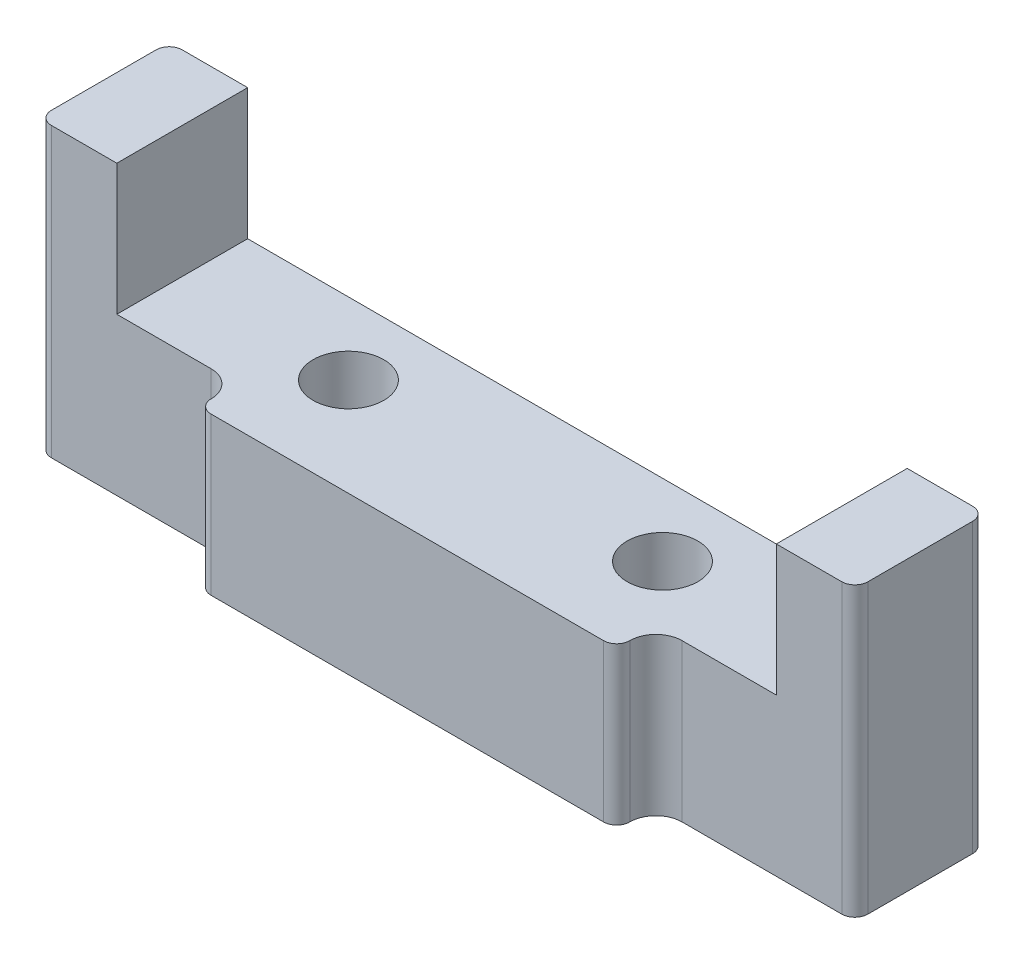
ISO-10303-21;
HEADER;
FILE_DESCRIPTION(('STEP AP214'),'2;1');
FILE_NAME('part.step','',(''),(''),'','','');
FILE_SCHEMA(('AUTOMOTIVE_DESIGN { 1 0 10303 214 1 1 1 1 }'));
ENDSEC;
DATA;
#1=APPLICATION_CONTEXT('core data for automotive mechanical design processes');
#2=APPLICATION_PROTOCOL_DEFINITION('international standard','automotive_design',2000,#1);
#3=PRODUCT_CONTEXT('',#1,'mechanical');
#4=PRODUCT('Part','Part','',(#3));
#5=PRODUCT_RELATED_PRODUCT_CATEGORY('part','',(#4));
#6=PRODUCT_DEFINITION_FORMATION('','',#4);
#7=PRODUCT_DEFINITION_CONTEXT('part definition',#1,'design');
#8=PRODUCT_DEFINITION('design','',#6,#7);
#9=PRODUCT_DEFINITION_SHAPE('','',#8);
#10=(LENGTH_UNIT() NAMED_UNIT(*) SI_UNIT(.MILLI.,.METRE.));
#11=(NAMED_UNIT(*) PLANE_ANGLE_UNIT() SI_UNIT($,.RADIAN.));
#12=(NAMED_UNIT(*) SI_UNIT($,.STERADIAN.) SOLID_ANGLE_UNIT());
#13=UNCERTAINTY_MEASURE_WITH_UNIT(LENGTH_MEASURE(1.E-05),#10,'distance_accuracy_value','');
#14=(GEOMETRIC_REPRESENTATION_CONTEXT(3) GLOBAL_UNCERTAINTY_ASSIGNED_CONTEXT((#13)) GLOBAL_UNIT_ASSIGNED_CONTEXT((#10,
#11,#12)) REPRESENTATION_CONTEXT('',''));
#15=CARTESIAN_POINT('',(0.,0.,0.));
#16=DIRECTION('',(0.,0.,1.));
#17=DIRECTION('',(1.,0.,0.));
#18=AXIS2_PLACEMENT_3D('',#15,#16,#17);
#19=CARTESIAN_POINT('',(0.,0.,5.));
#20=DIRECTION('',(0.,0.,1.));
#21=DIRECTION('',(1.,0.,0.));
#22=AXIS2_PLACEMENT_3D('',#19,#20,#21);
#23=PLANE('',#22);
#24=DIRECTION('',(-1.,0.,0.));
#25=VECTOR('',#24,1.);
#26=CARTESIAN_POINT('',(0.,2.5,5.));
#27=LINE('',#26,#25);
#28=CARTESIAN_POINT('',(-12.6,2.5,5.));
#29=VERTEX_POINT('',#28);
#30=CARTESIAN_POINT('',(-15.1,2.5,5.));
#31=VERTEX_POINT('',#30);
#32=EDGE_CURVE('E196',#29,#31,#27,.T.);
#33=ORIENTED_EDGE('',*,*,#32,.T.);
#34=DIRECTION('',(0.,-1.,0.));
#35=VECTOR('',#34,1.);
#36=CARTESIAN_POINT('',(-15.1,-8.5,5.));
#37=LINE('',#36,#35);
#38=CARTESIAN_POINT('',(-15.1,-8.5,5.));
#39=VERTEX_POINT('',#38);
#40=EDGE_CURVE('E285',#31,#39,#37,.T.);
#41=ORIENTED_EDGE('',*,*,#40,.T.);
#42=DIRECTION('',(1.,0.,0.));
#43=VECTOR('',#42,1.);
#44=CARTESIAN_POINT('',(0.,-8.5,5.));
#45=LINE('',#44,#43);
#46=CARTESIAN_POINT('',(-9.,-8.5,5.));
#47=VERTEX_POINT('',#46);
#48=EDGE_CURVE('E200',#39,#47,#45,.T.);
#49=ORIENTED_EDGE('',*,*,#48,.T.);
#50=DIRECTION('',(0.,-1.,0.));
#51=VECTOR('',#50,1.);
#52=CARTESIAN_POINT('',(-9.,0.,5.));
#53=LINE('',#52,#51);
#54=CARTESIAN_POINT('',(-9.,-2.5,5.));
#55=VERTEX_POINT('',#54);
#56=EDGE_CURVE('E238',#47,#55,#53,.F.);
#57=ORIENTED_EDGE('',*,*,#56,.T.);
#58=DIRECTION('',(-1.,0.,0.));
#59=VECTOR('',#58,1.);
#60=CARTESIAN_POINT('',(0.,-2.5,5.));
#61=LINE('',#60,#59);
#62=CARTESIAN_POINT('',(-12.6,-2.5,5.));
#63=VERTEX_POINT('',#62);
#64=EDGE_CURVE('E188',#55,#63,#61,.T.);
#65=ORIENTED_EDGE('',*,*,#64,.T.);
#66=DIRECTION('',(0.,1.,0.));
#67=VECTOR('',#66,1.);
#68=CARTESIAN_POINT('',(-12.6,0.,5.));
#69=LINE('',#68,#67);
#70=EDGE_CURVE('E194',#63,#29,#69,.T.);
#71=ORIENTED_EDGE('',*,*,#70,.T.);
#72=EDGE_LOOP('',(#33,#41,#49,#57,#65,#71));
#73=FACE_BOUND('',#72,.T.);
#74=ADVANCED_FACE('F36',(#73),#23,.T.);
#75=CARTESIAN_POINT('',(15.6,0.,5.));
#76=DIRECTION('',(-1.,0.,0.));
#77=DIRECTION('',(0.,-1.,0.));
#78=AXIS2_PLACEMENT_3D('',#75,#76,#77);
#79=PLANE('',#78);
#80=DIRECTION('',(0.,0.,-1.));
#81=VECTOR('',#80,1.);
#82=CARTESIAN_POINT('',(15.6,-8.5,5.));
#83=LINE('',#82,#81);
#84=CARTESIAN_POINT('',(15.6,-8.5,4.5));
#85=VERTEX_POINT('',#84);
#86=CARTESIAN_POINT('',(15.6,-8.5,0.5));
#87=VERTEX_POINT('',#86);
#88=EDGE_CURVE('E202',#85,#87,#83,.T.);
#89=ORIENTED_EDGE('',*,*,#88,.T.);
#90=DIRECTION('',(0.,1.,0.));
#91=VECTOR('',#90,1.);
#92=CARTESIAN_POINT('',(15.6,0.,0.5));
#93=LINE('',#92,#91);
#94=CARTESIAN_POINT('',(15.6,2.5,0.5));
#95=VERTEX_POINT('',#94);
#96=EDGE_CURVE('E251',#87,#95,#93,.T.);
#97=ORIENTED_EDGE('',*,*,#96,.T.);
#98=DIRECTION('',(0.,0.,-1.));
#99=VECTOR('',#98,1.);
#100=CARTESIAN_POINT('',(15.6,2.5,5.));
#101=LINE('',#100,#99);
#102=CARTESIAN_POINT('',(15.6,2.5,4.5));
#103=VERTEX_POINT('',#102);
#104=EDGE_CURVE('E183',#103,#95,#101,.T.);
#105=ORIENTED_EDGE('',*,*,#104,.F.);
#106=DIRECTION('',(0.,1.,0.));
#107=VECTOR('',#106,1.);
#108=CARTESIAN_POINT('',(15.6,-8.5,4.5));
#109=LINE('',#108,#107);
#110=EDGE_CURVE('E249',#103,#85,#109,.F.);
#111=ORIENTED_EDGE('',*,*,#110,.T.);
#112=EDGE_LOOP('',(#89,#97,#105,#111));
#113=FACE_BOUND('',#112,.T.);
#114=ADVANCED_FACE('F320',(#113),#79,.F.);
#115=CARTESIAN_POINT('',(0.,2.5,5.));
#116=DIRECTION('',(0.,-1.,0.));
#117=DIRECTION('',(1.,0.,0.));
#118=AXIS2_PLACEMENT_3D('',#115,#116,#117);
#119=PLANE('',#118);
#120=ORIENTED_EDGE('',*,*,#104,.T.);
#121=CARTESIAN_POINT('',(15.1,2.5,0.5));
#122=DIRECTION('',(0.,-1.,0.));
#123=DIRECTION('',(1.,0.,0.));
#124=AXIS2_PLACEMENT_3D('',#121,#122,#123);
#125=CIRCLE('',#124,0.5);
#126=CARTESIAN_POINT('',(15.1,2.5,0.));
#127=VERTEX_POINT('',#126);
#128=EDGE_CURVE('E256',#95,#127,#125,.F.);
#129=ORIENTED_EDGE('',*,*,#128,.T.);
#130=DIRECTION('',(-1.,0.,0.));
#131=VECTOR('',#130,1.);
#132=CARTESIAN_POINT('',(0.,2.5,0.));
#133=LINE('',#132,#131);
#134=CARTESIAN_POINT('',(12.6,2.5,0.));
#135=VERTEX_POINT('',#134);
#136=EDGE_CURVE('E179',#127,#135,#133,.T.);
#137=ORIENTED_EDGE('',*,*,#136,.T.);
#138=DIRECTION('',(0.,0.,-1.));
#139=VECTOR('',#138,1.);
#140=CARTESIAN_POINT('',(12.6,2.5,5.));
#141=LINE('',#140,#139);
#142=CARTESIAN_POINT('',(12.6,2.5,5.));
#143=VERTEX_POINT('',#142);
#144=EDGE_CURVE('E175',#143,#135,#141,.T.);
#145=ORIENTED_EDGE('',*,*,#144,.F.);
#146=DIRECTION('',(-1.,0.,0.));
#147=VECTOR('',#146,1.);
#148=CARTESIAN_POINT('',(0.,2.5,5.));
#149=LINE('',#148,#147);
#150=CARTESIAN_POINT('',(15.1,2.5,5.));
#151=VERTEX_POINT('',#150);
#152=EDGE_CURVE('E162',#151,#143,#149,.T.);
#153=ORIENTED_EDGE('',*,*,#152,.F.);
#154=CARTESIAN_POINT('',(15.1,2.5,4.5));
#155=DIRECTION('',(0.,-1.,0.));
#156=DIRECTION('',(1.,0.,0.));
#157=AXIS2_PLACEMENT_3D('',#154,#155,#156);
#158=CIRCLE('',#157,0.5);
#159=EDGE_CURVE('E254',#151,#103,#158,.F.);
#160=ORIENTED_EDGE('',*,*,#159,.T.);
#161=EDGE_LOOP('',(#120,#129,#137,#145,#153,#160));
#162=FACE_BOUND('',#161,.T.);
#163=ADVANCED_FACE('F177',(#162),#119,.F.);
#164=CARTESIAN_POINT('',(12.6,0.,5.));
#165=DIRECTION('',(-1.,0.,0.));
#166=DIRECTION('',(0.,0.,1.));
#167=AXIS2_PLACEMENT_3D('',#164,#165,#166);
#168=PLANE('',#167);
#169=DIRECTION('',(0.,1.,0.));
#170=VECTOR('',#169,1.);
#171=CARTESIAN_POINT('',(12.6,0.,0.));
#172=LINE('',#171,#170);
#173=CARTESIAN_POINT('',(12.6,-2.5,0.));
#174=VERTEX_POINT('',#173);
#175=EDGE_CURVE('E204',#174,#135,#172,.T.);
#176=ORIENTED_EDGE('',*,*,#175,.F.);
#177=DIRECTION('',(0.,0.,-1.));
#178=VECTOR('',#177,1.);
#179=CARTESIAN_POINT('',(12.6,-2.5,5.));
#180=LINE('',#179,#178);
#181=CARTESIAN_POINT('',(12.6,-2.5,5.));
#182=VERTEX_POINT('',#181);
#183=EDGE_CURVE('E184',#182,#174,#180,.T.);
#184=ORIENTED_EDGE('',*,*,#183,.F.);
#185=DIRECTION('',(0.,1.,0.));
#186=VECTOR('',#185,1.);
#187=CARTESIAN_POINT('',(12.6,0.,5.));
#188=LINE('',#187,#186);
#189=EDGE_CURVE('E168',#182,#143,#188,.T.);
#190=ORIENTED_EDGE('',*,*,#189,.T.);
#191=ORIENTED_EDGE('',*,*,#144,.T.);
#192=EDGE_LOOP('',(#176,#184,#190,#191));
#193=FACE_BOUND('',#192,.T.);
#194=ADVANCED_FACE('F186',(#193),#168,.T.);
#195=CARTESIAN_POINT('',(0.,-2.5,5.));
#196=DIRECTION('',(0.,-1.,0.));
#197=DIRECTION('',(1.,0.,0.));
#198=AXIS2_PLACEMENT_3D('',#195,#196,#197);
#199=PLANE('',#198);
#200=CARTESIAN_POINT('',(-6.,-2.5,2.75));
#201=DIRECTION('',(0.,-1.,0.));
#202=DIRECTION('',(1.,0.,0.));
#203=AXIS2_PLACEMENT_3D('',#200,#201,#202);
#204=CIRCLE('',#203,1.35);
#205=CARTESIAN_POINT('',(-4.65,-2.5,2.75));
#206=VERTEX_POINT('',#205);
#207=EDGE_CURVE('E395',#206,#206,#204,.T.);
#208=ORIENTED_EDGE('',*,*,#207,.T.);
#209=EDGE_LOOP('',(#208));
#210=FACE_BOUND('',#209,.T.);
#211=CARTESIAN_POINT('',(6.,-2.5,2.75));
#212=DIRECTION('',(0.,-1.,0.));
#213=DIRECTION('',(1.,0.,0.));
#214=AXIS2_PLACEMENT_3D('',#211,#212,#213);
#215=CIRCLE('',#214,1.35);
#216=CARTESIAN_POINT('',(7.35,-2.5,2.75));
#217=VERTEX_POINT('',#216);
#218=EDGE_CURVE('E400',#217,#217,#215,.T.);
#219=ORIENTED_EDGE('',*,*,#218,.T.);
#220=EDGE_LOOP('',(#219));
#221=FACE_BOUND('',#220,.T.);
#222=DIRECTION('',(-1.,0.,0.));
#223=VECTOR('',#222,1.);
#224=CARTESIAN_POINT('',(8.,-2.5,6.5));
#225=LINE('',#224,#223);
#226=CARTESIAN_POINT('',(7.5,-2.5,6.5));
#227=VERTEX_POINT('',#226);
#228=CARTESIAN_POINT('',(-7.5,-2.5,6.5));
#229=VERTEX_POINT('',#228);
#230=EDGE_CURVE('E205',#227,#229,#225,.T.);
#231=ORIENTED_EDGE('',*,*,#230,.F.);
#232=CARTESIAN_POINT('',(7.5,-2.5,6.));
#233=DIRECTION('',(0.,-1.,0.));
#234=DIRECTION('',(1.,0.,0.));
#235=AXIS2_PLACEMENT_3D('',#232,#233,#234);
#236=CIRCLE('',#235,0.5);
#237=CARTESIAN_POINT('',(8.,-2.5,6.));
#238=VERTEX_POINT('',#237);
#239=EDGE_CURVE('E283',#227,#238,#236,.F.);
#240=ORIENTED_EDGE('',*,*,#239,.T.);
#241=CARTESIAN_POINT('',(9.,-2.5,6.));
#242=DIRECTION('',(0.,-1.,0.));
#243=DIRECTION('',(1.,0.,0.));
#244=AXIS2_PLACEMENT_3D('',#241,#242,#243);
#245=CIRCLE('',#244,1.);
#246=CARTESIAN_POINT('',(9.,-2.5,5.));
#247=VERTEX_POINT('',#246);
#248=EDGE_CURVE('E240',#238,#247,#245,.T.);
#249=ORIENTED_EDGE('',*,*,#248,.T.);
#250=EDGE_CURVE('E190',#182,#247,#61,.T.);
#251=ORIENTED_EDGE('',*,*,#250,.F.);
#252=ORIENTED_EDGE('',*,*,#183,.T.);
#253=DIRECTION('',(-1.,0.,0.));
#254=VECTOR('',#253,1.);
#255=CARTESIAN_POINT('',(0.,-2.5,0.));
#256=LINE('',#255,#254);
#257=CARTESIAN_POINT('',(-12.6,-2.5,0.));
#258=VERTEX_POINT('',#257);
#259=EDGE_CURVE('E207',#174,#258,#256,.T.);
#260=ORIENTED_EDGE('',*,*,#259,.T.);
#261=DIRECTION('',(0.,0.,-1.));
#262=VECTOR('',#261,1.);
#263=CARTESIAN_POINT('',(-12.6,-2.5,5.));
#264=LINE('',#263,#262);
#265=EDGE_CURVE('E225',#63,#258,#264,.T.);
#266=ORIENTED_EDGE('',*,*,#265,.F.);
#267=ORIENTED_EDGE('',*,*,#64,.F.);
#268=CARTESIAN_POINT('',(-9.,-2.5,6.));
#269=DIRECTION('',(0.,-1.,0.));
#270=DIRECTION('',(1.,0.,0.));
#271=AXIS2_PLACEMENT_3D('',#268,#269,#270);
#272=CIRCLE('',#271,1.);
#273=CARTESIAN_POINT('',(-8.,-2.5,6.));
#274=VERTEX_POINT('',#273);
#275=EDGE_CURVE('E247',#55,#274,#272,.T.);
#276=ORIENTED_EDGE('',*,*,#275,.T.);
#277=CARTESIAN_POINT('',(-7.5,-2.5,6.));
#278=DIRECTION('',(0.,-1.,0.));
#279=DIRECTION('',(1.,0.,0.));
#280=AXIS2_PLACEMENT_3D('',#277,#278,#279);
#281=CIRCLE('',#280,0.5);
#282=EDGE_CURVE('E281',#274,#229,#281,.F.);
#283=ORIENTED_EDGE('',*,*,#282,.T.);
#284=EDGE_LOOP('',(#231,#240,#249,#251,#252,#260,#266,#267,#276,#283));
#285=FACE_BOUND('',#284,.T.);
#286=ADVANCED_FACE('F349',(#210,#221,#285),#199,.F.);
#287=CARTESIAN_POINT('',(-12.6,0.,5.));
#288=DIRECTION('',(-1.,0.,0.));
#289=DIRECTION('',(0.,0.,1.));
#290=AXIS2_PLACEMENT_3D('',#287,#288,#289);
#291=PLANE('',#290);
#292=DIRECTION('',(0.,1.,0.));
#293=VECTOR('',#292,1.);
#294=CARTESIAN_POINT('',(-12.6,0.,0.));
#295=LINE('',#294,#293);
#296=CARTESIAN_POINT('',(-12.6,2.5,0.));
#297=VERTEX_POINT('',#296);
#298=EDGE_CURVE('E209',#258,#297,#295,.T.);
#299=ORIENTED_EDGE('',*,*,#298,.T.);
#300=DIRECTION('',(0.,0.,-1.));
#301=VECTOR('',#300,1.);
#302=CARTESIAN_POINT('',(-12.6,2.5,5.));
#303=LINE('',#302,#301);
#304=EDGE_CURVE('E222',#29,#297,#303,.T.);
#305=ORIENTED_EDGE('',*,*,#304,.F.);
#306=ORIENTED_EDGE('',*,*,#70,.F.);
#307=ORIENTED_EDGE('',*,*,#265,.T.);
#308=EDGE_LOOP('',(#299,#305,#306,#307));
#309=FACE_BOUND('',#308,.T.);
#310=ADVANCED_FACE('F346',(#309),#291,.F.);
#311=CARTESIAN_POINT('',(0.,2.5,5.));
#312=DIRECTION('',(0.,-1.,0.));
#313=DIRECTION('',(1.,0.,0.));
#314=AXIS2_PLACEMENT_3D('',#311,#312,#313);
#315=PLANE('',#314);
#316=DIRECTION('',(0.,0.,-1.));
#317=VECTOR('',#316,1.);
#318=CARTESIAN_POINT('',(-15.6,2.5,5.));
#319=LINE('',#318,#317);
#320=CARTESIAN_POINT('',(-15.6,2.5,4.5));
#321=VERTEX_POINT('',#320);
#322=CARTESIAN_POINT('',(-15.6,2.5,0.5));
#323=VERTEX_POINT('',#322);
#324=EDGE_CURVE('E220',#321,#323,#319,.T.);
#325=ORIENTED_EDGE('',*,*,#324,.F.);
#326=CARTESIAN_POINT('',(-15.1,2.5,4.5));
#327=DIRECTION('',(0.,-1.,0.));
#328=DIRECTION('',(1.,0.,0.));
#329=AXIS2_PLACEMENT_3D('',#326,#327,#328);
#330=CIRCLE('',#329,0.5);
#331=EDGE_CURVE('E11',#321,#31,#330,.F.);
#332=ORIENTED_EDGE('',*,*,#331,.T.);
#333=ORIENTED_EDGE('',*,*,#32,.F.);
#334=ORIENTED_EDGE('',*,*,#304,.T.);
#335=DIRECTION('',(-1.,0.,0.));
#336=VECTOR('',#335,1.);
#337=CARTESIAN_POINT('',(0.,2.5,0.));
#338=LINE('',#337,#336);
#339=CARTESIAN_POINT('',(-15.1,2.5,0.));
#340=VERTEX_POINT('',#339);
#341=EDGE_CURVE('E211',#297,#340,#338,.T.);
#342=ORIENTED_EDGE('',*,*,#341,.T.);
#343=CARTESIAN_POINT('',(-15.1,2.5,0.5));
#344=DIRECTION('',(0.,-1.,0.));
#345=DIRECTION('',(1.,0.,0.));
#346=AXIS2_PLACEMENT_3D('',#343,#344,#345);
#347=CIRCLE('',#346,0.5);
#348=EDGE_CURVE('E44',#340,#323,#347,.F.);
#349=ORIENTED_EDGE('',*,*,#348,.T.);
#350=EDGE_LOOP('',(#325,#332,#333,#334,#342,#349));
#351=FACE_BOUND('',#350,.T.);
#352=ADVANCED_FACE('F306',(#351),#315,.F.);
#353=CARTESIAN_POINT('',(-15.6,0.,5.));
#354=DIRECTION('',(1.,0.,0.));
#355=DIRECTION('',(0.,1.,0.));
#356=AXIS2_PLACEMENT_3D('',#353,#354,#355);
#357=PLANE('',#356);
#358=DIRECTION('',(0.,0.,-1.));
#359=VECTOR('',#358,1.);
#360=CARTESIAN_POINT('',(-15.6,-8.5,5.));
#361=LINE('',#360,#359);
#362=CARTESIAN_POINT('',(-15.6,-8.5,4.5));
#363=VERTEX_POINT('',#362);
#364=CARTESIAN_POINT('',(-15.6,-8.5,0.5));
#365=VERTEX_POINT('',#364);
#366=EDGE_CURVE('E217',#363,#365,#361,.T.);
#367=ORIENTED_EDGE('',*,*,#366,.F.);
#368=DIRECTION('',(0.,-1.,0.));
#369=VECTOR('',#368,1.);
#370=CARTESIAN_POINT('',(-15.6,2.5,4.5));
#371=LINE('',#370,#369);
#372=EDGE_CURVE('E57',#363,#321,#371,.F.);
#373=ORIENTED_EDGE('',*,*,#372,.T.);
#374=ORIENTED_EDGE('',*,*,#324,.T.);
#375=DIRECTION('',(0.,-1.,0.));
#376=VECTOR('',#375,1.);
#377=CARTESIAN_POINT('',(-15.6,0.,0.5));
#378=LINE('',#377,#376);
#379=EDGE_CURVE('E288',#323,#365,#378,.T.);
#380=ORIENTED_EDGE('',*,*,#379,.T.);
#381=EDGE_LOOP('',(#367,#373,#374,#380));
#382=FACE_BOUND('',#381,.T.);
#383=ADVANCED_FACE('F292',(#382),#357,.F.);
#384=CARTESIAN_POINT('',(0.,-8.5,5.));
#385=DIRECTION('',(0.,1.,0.));
#386=DIRECTION('',(0.,0.,1.));
#387=AXIS2_PLACEMENT_3D('',#384,#385,#386);
#388=PLANE('',#387);
#389=CARTESIAN_POINT('',(-6.,-8.5,2.75));
#390=DIRECTION('',(0.,-1.,0.));
#391=DIRECTION('',(0.,0.,-1.));
#392=AXIS2_PLACEMENT_3D('',#389,#390,#391);
#393=CIRCLE('',#392,1.35);
#394=CARTESIAN_POINT('',(-6.,-8.5,1.4));
#395=VERTEX_POINT('',#394);
#396=EDGE_CURVE('E403',#395,#395,#393,.T.);
#397=ORIENTED_EDGE('',*,*,#396,.F.);
#398=EDGE_LOOP('',(#397));
#399=FACE_BOUND('',#398,.T.);
#400=CARTESIAN_POINT('',(6.,-8.5,2.75));
#401=DIRECTION('',(0.,-1.,0.));
#402=DIRECTION('',(0.,0.,1.));
#403=AXIS2_PLACEMENT_3D('',#400,#401,#402);
#404=CIRCLE('',#403,1.35);
#405=CARTESIAN_POINT('',(6.,-8.5,4.1));
#406=VERTEX_POINT('',#405);
#407=EDGE_CURVE('E404',#406,#406,#404,.T.);
#408=ORIENTED_EDGE('',*,*,#407,.F.);
#409=EDGE_LOOP('',(#408));
#410=FACE_BOUND('',#409,.T.);
#411=DIRECTION('',(1.,0.,0.));
#412=VECTOR('',#411,1.);
#413=CARTESIAN_POINT('',(0.,-8.5,0.));
#414=LINE('',#413,#412);
#415=CARTESIAN_POINT('',(-15.1,-8.5,0.));
#416=VERTEX_POINT('',#415);
#417=CARTESIAN_POINT('',(15.1,-8.5,0.));
#418=VERTEX_POINT('',#417);
#419=EDGE_CURVE('E172',#416,#418,#414,.T.);
#420=ORIENTED_EDGE('',*,*,#419,.T.);
#421=CARTESIAN_POINT('',(15.1,-8.5,0.5));
#422=DIRECTION('',(0.,1.,0.));
#423=DIRECTION('',(0.,0.,1.));
#424=AXIS2_PLACEMENT_3D('',#421,#422,#423);
#425=CIRCLE('',#424,0.5);
#426=EDGE_CURVE('E272',#418,#87,#425,.F.);
#427=ORIENTED_EDGE('',*,*,#426,.T.);
#428=ORIENTED_EDGE('',*,*,#88,.F.);
#429=CARTESIAN_POINT('',(15.1,-8.5,4.5));
#430=DIRECTION('',(0.,1.,0.));
#431=DIRECTION('',(0.,0.,1.));
#432=AXIS2_PLACEMENT_3D('',#429,#430,#431);
#433=CIRCLE('',#432,0.5);
#434=CARTESIAN_POINT('',(15.1,-8.5,5.));
#435=VERTEX_POINT('',#434);
#436=EDGE_CURVE('E270',#85,#435,#433,.F.);
#437=ORIENTED_EDGE('',*,*,#436,.T.);
#438=CARTESIAN_POINT('',(9.,-8.5,5.));
#439=VERTEX_POINT('',#438);
#440=EDGE_CURVE('E199',#439,#435,#45,.T.);
#441=ORIENTED_EDGE('',*,*,#440,.F.);
#442=CARTESIAN_POINT('',(9.,-8.5,6.));
#443=DIRECTION('',(0.,1.,0.));
#444=DIRECTION('',(0.,0.,1.));
#445=AXIS2_PLACEMENT_3D('',#442,#443,#444);
#446=CIRCLE('',#445,1.);
#447=CARTESIAN_POINT('',(8.,-8.5,6.));
#448=VERTEX_POINT('',#447);
#449=EDGE_CURVE('E242',#439,#448,#446,.T.);
#450=ORIENTED_EDGE('',*,*,#449,.T.);
#451=CARTESIAN_POINT('',(7.5,-8.5,6.));
#452=DIRECTION('',(0.,1.,0.));
#453=DIRECTION('',(0.,0.,1.));
#454=AXIS2_PLACEMENT_3D('',#451,#452,#453);
#455=CIRCLE('',#454,0.5);
#456=CARTESIAN_POINT('',(7.5,-8.5,6.5));
#457=VERTEX_POINT('',#456);
#458=EDGE_CURVE('E268',#448,#457,#455,.F.);
#459=ORIENTED_EDGE('',*,*,#458,.T.);
#460=DIRECTION('',(1.,0.,0.));
#461=VECTOR('',#460,1.);
#462=CARTESIAN_POINT('',(8.,-8.5,6.5));
#463=LINE('',#462,#461);
#464=CARTESIAN_POINT('',(-7.5,-8.5,6.5));
#465=VERTEX_POINT('',#464);
#466=EDGE_CURVE('E394',#465,#457,#463,.T.);
#467=ORIENTED_EDGE('',*,*,#466,.F.);
#468=CARTESIAN_POINT('',(-7.5,-8.5,6.));
#469=DIRECTION('',(0.,1.,0.));
#470=DIRECTION('',(0.,0.,1.));
#471=AXIS2_PLACEMENT_3D('',#468,#469,#470);
#472=CIRCLE('',#471,0.5);
#473=CARTESIAN_POINT('',(-8.,-8.5,6.));
#474=VERTEX_POINT('',#473);
#475=EDGE_CURVE('E266',#465,#474,#472,.F.);
#476=ORIENTED_EDGE('',*,*,#475,.T.);
#477=CARTESIAN_POINT('',(-9.,-8.5,6.));
#478=DIRECTION('',(0.,1.,0.));
#479=DIRECTION('',(0.,0.,1.));
#480=AXIS2_PLACEMENT_3D('',#477,#478,#479);
#481=CIRCLE('',#480,1.);
#482=EDGE_CURVE('E244',#474,#47,#481,.T.);
#483=ORIENTED_EDGE('',*,*,#482,.T.);
#484=ORIENTED_EDGE('',*,*,#48,.F.);
#485=CARTESIAN_POINT('',(-15.1,-8.5,4.5));
#486=DIRECTION('',(0.,1.,0.));
#487=DIRECTION('',(0.,0.,1.));
#488=AXIS2_PLACEMENT_3D('',#485,#486,#487);
#489=CIRCLE('',#488,0.5);
#490=EDGE_CURVE('E264',#39,#363,#489,.F.);
#491=ORIENTED_EDGE('',*,*,#490,.T.);
#492=ORIENTED_EDGE('',*,*,#366,.T.);
#493=CARTESIAN_POINT('',(-15.1,-8.5,0.5));
#494=DIRECTION('',(0.,1.,0.));
#495=DIRECTION('',(0.,0.,1.));
#496=AXIS2_PLACEMENT_3D('',#493,#494,#495);
#497=CIRCLE('',#496,0.5);
#498=EDGE_CURVE('E262',#365,#416,#497,.F.);
#499=ORIENTED_EDGE('',*,*,#498,.T.);
#500=EDGE_LOOP('',(#420,#427,#428,#437,#441,#450,#459,#467,#476,#483,#484,#491,#492,#499));
#501=FACE_BOUND('',#500,.T.);
#502=ADVANCED_FACE('F295',(#399,#410,#501),#388,.F.);
#503=ORIENTED_EDGE('',*,*,#440,.T.);
#504=DIRECTION('',(0.,1.,0.));
#505=VECTOR('',#504,1.);
#506=CARTESIAN_POINT('',(15.1,2.5,5.));
#507=LINE('',#506,#505);
#508=EDGE_CURVE('E170',#435,#151,#507,.T.);
#509=ORIENTED_EDGE('',*,*,#508,.T.);
#510=ORIENTED_EDGE('',*,*,#152,.T.);
#511=ORIENTED_EDGE('',*,*,#189,.F.);
#512=ORIENTED_EDGE('',*,*,#250,.T.);
#513=DIRECTION('',(0.,1.,0.));
#514=VECTOR('',#513,1.);
#515=CARTESIAN_POINT('',(9.,0.,5.));
#516=LINE('',#515,#514);
#517=EDGE_CURVE('E233',#247,#439,#516,.F.);
#518=ORIENTED_EDGE('',*,*,#517,.T.);
#519=EDGE_LOOP('',(#503,#509,#510,#511,#512,#518));
#520=FACE_BOUND('',#519,.T.);
#521=ADVANCED_FACE('F165',(#520),#23,.T.);
#522=CARTESIAN_POINT('',(0.,0.,0.));
#523=DIRECTION('',(0.,0.,1.));
#524=DIRECTION('',(1.,0.,0.));
#525=AXIS2_PLACEMENT_3D('',#522,#523,#524);
#526=PLANE('',#525);
#527=ORIENTED_EDGE('',*,*,#136,.F.);
#528=DIRECTION('',(0.,1.,0.));
#529=VECTOR('',#528,1.);
#530=CARTESIAN_POINT('',(15.1,0.,0.));
#531=LINE('',#530,#529);
#532=EDGE_CURVE('E260',#127,#418,#531,.F.);
#533=ORIENTED_EDGE('',*,*,#532,.T.);
#534=ORIENTED_EDGE('',*,*,#419,.F.);
#535=DIRECTION('',(0.,-1.,0.));
#536=VECTOR('',#535,1.);
#537=CARTESIAN_POINT('',(-15.1,0.,0.));
#538=LINE('',#537,#536);
#539=EDGE_CURVE('E258',#416,#340,#538,.F.);
#540=ORIENTED_EDGE('',*,*,#539,.T.);
#541=ORIENTED_EDGE('',*,*,#341,.F.);
#542=ORIENTED_EDGE('',*,*,#298,.F.);
#543=ORIENTED_EDGE('',*,*,#259,.F.);
#544=ORIENTED_EDGE('',*,*,#175,.T.);
#545=EDGE_LOOP('',(#527,#533,#534,#540,#541,#542,#543,#544));
#546=FACE_BOUND('',#545,.T.);
#547=ADVANCED_FACE('F311',(#546),#526,.F.);
#548=CARTESIAN_POINT('',(0.,0.,6.5));
#549=DIRECTION('',(0.,0.,1.));
#550=DIRECTION('',(1.,0.,0.));
#551=AXIS2_PLACEMENT_3D('',#548,#549,#550);
#552=PLANE('',#551);
#553=ORIENTED_EDGE('',*,*,#466,.T.);
#554=DIRECTION('',(0.,1.,0.));
#555=VECTOR('',#554,1.);
#556=CARTESIAN_POINT('',(7.5,-2.5,6.5));
#557=LINE('',#556,#555);
#558=EDGE_CURVE('E278',#457,#227,#557,.T.);
#559=ORIENTED_EDGE('',*,*,#558,.T.);
#560=ORIENTED_EDGE('',*,*,#230,.T.);
#561=DIRECTION('',(0.,-1.,0.));
#562=VECTOR('',#561,1.);
#563=CARTESIAN_POINT('',(-7.5,-8.5,6.5));
#564=LINE('',#563,#562);
#565=EDGE_CURVE('E275',#229,#465,#564,.T.);
#566=ORIENTED_EDGE('',*,*,#565,.T.);
#567=EDGE_LOOP('',(#553,#559,#560,#566));
#568=FACE_BOUND('',#567,.T.);
#569=ADVANCED_FACE('F334',(#568),#552,.T.);
#570=CARTESIAN_POINT('',(6.,2.5,2.75));
#571=DIRECTION('',(0.,-1.,0.));
#572=DIRECTION('',(0.,0.,-1.));
#573=AXIS2_PLACEMENT_3D('',#570,#571,#572);
#574=CYLINDRICAL_SURFACE('',#573,1.35);
#575=ORIENTED_EDGE('',*,*,#407,.T.);
#576=EDGE_LOOP('',(#575));
#577=FACE_BOUND('',#576,.T.);
#578=ORIENTED_EDGE('',*,*,#218,.F.);
#579=EDGE_LOOP('',(#578));
#580=FACE_BOUND('',#579,.T.);
#581=ADVANCED_FACE('F411',(#577,#580),#574,.F.);
#582=CARTESIAN_POINT('',(-6.,2.5,2.75));
#583=DIRECTION('',(0.,-1.,0.));
#584=DIRECTION('',(0.,0.,-1.));
#585=AXIS2_PLACEMENT_3D('',#582,#583,#584);
#586=CYLINDRICAL_SURFACE('',#585,1.35);
#587=ORIENTED_EDGE('',*,*,#396,.T.);
#588=EDGE_LOOP('',(#587));
#589=FACE_BOUND('',#588,.T.);
#590=ORIENTED_EDGE('',*,*,#207,.F.);
#591=EDGE_LOOP('',(#590));
#592=FACE_BOUND('',#591,.T.);
#593=ADVANCED_FACE('F361',(#589,#592),#586,.F.);
#594=CARTESIAN_POINT('',(9.,-8.5,6.));
#595=DIRECTION('',(0.,1.,0.));
#596=DIRECTION('',(0.,0.,1.));
#597=AXIS2_PLACEMENT_3D('',#594,#595,#596);
#598=CYLINDRICAL_SURFACE('',#597,1.);
#599=ORIENTED_EDGE('',*,*,#449,.F.);
#600=ORIENTED_EDGE('',*,*,#517,.F.);
#601=ORIENTED_EDGE('',*,*,#248,.F.);
#602=DIRECTION('',(0.,1.,0.));
#603=VECTOR('',#602,1.);
#604=CARTESIAN_POINT('',(8.,-8.5,6.));
#605=LINE('',#604,#603);
#606=EDGE_CURVE('E230',#448,#238,#605,.T.);
#607=ORIENTED_EDGE('',*,*,#606,.F.);
#608=EDGE_LOOP('',(#599,#600,#601,#607));
#609=FACE_BOUND('',#608,.T.);
#610=ADVANCED_FACE('F357',(#609),#598,.F.);
#611=CARTESIAN_POINT('',(-9.,-8.5,6.));
#612=DIRECTION('',(0.,-1.,0.));
#613=DIRECTION('',(0.,0.,-1.));
#614=AXIS2_PLACEMENT_3D('',#611,#612,#613);
#615=CYLINDRICAL_SURFACE('',#614,1.);
#616=ORIENTED_EDGE('',*,*,#275,.F.);
#617=ORIENTED_EDGE('',*,*,#56,.F.);
#618=ORIENTED_EDGE('',*,*,#482,.F.);
#619=DIRECTION('',(0.,-1.,0.));
#620=VECTOR('',#619,1.);
#621=CARTESIAN_POINT('',(-8.,-8.5,6.));
#622=LINE('',#621,#620);
#623=EDGE_CURVE('E235',#274,#474,#622,.T.);
#624=ORIENTED_EDGE('',*,*,#623,.F.);
#625=EDGE_LOOP('',(#616,#617,#618,#624));
#626=FACE_BOUND('',#625,.T.);
#627=ADVANCED_FACE('F360',(#626),#615,.F.);
#628=CARTESIAN_POINT('',(15.1,0.,0.5));
#629=DIRECTION('',(0.,1.,0.));
#630=DIRECTION('',(-1.,0.,0.));
#631=AXIS2_PLACEMENT_3D('',#628,#629,#630);
#632=CYLINDRICAL_SURFACE('',#631,0.5);
#633=ORIENTED_EDGE('',*,*,#426,.F.);
#634=ORIENTED_EDGE('',*,*,#532,.F.);
#635=ORIENTED_EDGE('',*,*,#128,.F.);
#636=ORIENTED_EDGE('',*,*,#96,.F.);
#637=EDGE_LOOP('',(#633,#634,#635,#636));
#638=FACE_BOUND('',#637,.T.);
#639=ADVANCED_FACE('F365',(#638),#632,.T.);
#640=CARTESIAN_POINT('',(15.1,0.,4.5));
#641=DIRECTION('',(0.,-1.,0.));
#642=DIRECTION('',(1.,0.,0.));
#643=AXIS2_PLACEMENT_3D('',#640,#641,#642);
#644=CYLINDRICAL_SURFACE('',#643,0.5);
#645=ORIENTED_EDGE('',*,*,#436,.F.);
#646=ORIENTED_EDGE('',*,*,#110,.F.);
#647=ORIENTED_EDGE('',*,*,#159,.F.);
#648=ORIENTED_EDGE('',*,*,#508,.F.);
#649=EDGE_LOOP('',(#645,#646,#647,#648));
#650=FACE_BOUND('',#649,.T.);
#651=ADVANCED_FACE('F369',(#650),#644,.T.);
#652=CARTESIAN_POINT('',(7.5,0.,6.));
#653=DIRECTION('',(0.,-1.,0.));
#654=DIRECTION('',(0.,0.,-1.));
#655=AXIS2_PLACEMENT_3D('',#652,#653,#654);
#656=CYLINDRICAL_SURFACE('',#655,0.5);
#657=ORIENTED_EDGE('',*,*,#458,.F.);
#658=ORIENTED_EDGE('',*,*,#606,.T.);
#659=ORIENTED_EDGE('',*,*,#239,.F.);
#660=ORIENTED_EDGE('',*,*,#558,.F.);
#661=EDGE_LOOP('',(#657,#658,#659,#660));
#662=FACE_BOUND('',#661,.T.);
#663=ADVANCED_FACE('F373',(#662),#656,.T.);
#664=CARTESIAN_POINT('',(-7.5,0.,6.));
#665=DIRECTION('',(0.,1.,0.));
#666=DIRECTION('',(0.,0.,1.));
#667=AXIS2_PLACEMENT_3D('',#664,#665,#666);
#668=CYLINDRICAL_SURFACE('',#667,0.5);
#669=ORIENTED_EDGE('',*,*,#282,.F.);
#670=ORIENTED_EDGE('',*,*,#623,.T.);
#671=ORIENTED_EDGE('',*,*,#475,.F.);
#672=ORIENTED_EDGE('',*,*,#565,.F.);
#673=EDGE_LOOP('',(#669,#670,#671,#672));
#674=FACE_BOUND('',#673,.T.);
#675=ADVANCED_FACE('F318',(#674),#668,.T.);
#676=CARTESIAN_POINT('',(-15.1,0.,4.5));
#677=DIRECTION('',(0.,1.,0.));
#678=DIRECTION('',(-1.,0.,0.));
#679=AXIS2_PLACEMENT_3D('',#676,#677,#678);
#680=CYLINDRICAL_SURFACE('',#679,0.5);
#681=ORIENTED_EDGE('',*,*,#331,.F.);
#682=ORIENTED_EDGE('',*,*,#372,.F.);
#683=ORIENTED_EDGE('',*,*,#490,.F.);
#684=ORIENTED_EDGE('',*,*,#40,.F.);
#685=EDGE_LOOP('',(#681,#682,#683,#684));
#686=FACE_BOUND('',#685,.T.);
#687=ADVANCED_FACE('F301',(#686),#680,.T.);
#688=CARTESIAN_POINT('',(-15.1,0.,0.5));
#689=DIRECTION('',(0.,-1.,0.));
#690=DIRECTION('',(1.,0.,0.));
#691=AXIS2_PLACEMENT_3D('',#688,#689,#690);
#692=CYLINDRICAL_SURFACE('',#691,0.5);
#693=ORIENTED_EDGE('',*,*,#348,.F.);
#694=ORIENTED_EDGE('',*,*,#539,.F.);
#695=ORIENTED_EDGE('',*,*,#498,.F.);
#696=ORIENTED_EDGE('',*,*,#379,.F.);
#697=EDGE_LOOP('',(#693,#694,#695,#696));
#698=FACE_BOUND('',#697,.T.);
#699=ADVANCED_FACE('F38',(#698),#692,.T.);
#700=CLOSED_SHELL('',(#74,#114,#163,#194,#286,#310,#352,#383,#502,#521,#547,#569,#581,#593,#610,
#627,#639,#651,#663,#675,#687,#699));
#701=MANIFOLD_SOLID_BREP('B2',#700);
#702=ADVANCED_BREP_SHAPE_REPRESENTATION('',(#18,#701),#14);
#703=SHAPE_DEFINITION_REPRESENTATION(#9,#702);
ENDSEC;
END-ISO-10303-21;
